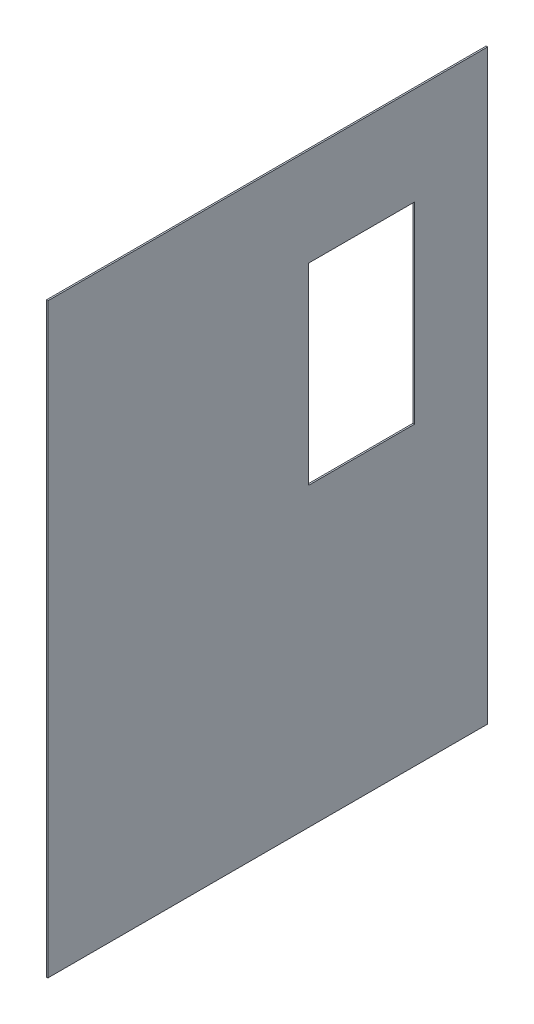
ISO-10303-21;
HEADER;
FILE_DESCRIPTION(('STEP AP214'),'2;1');
FILE_NAME('part.step','',(''),(''),'','','');
FILE_SCHEMA(('AUTOMOTIVE_DESIGN { 1 0 10303 214 1 1 1 1 }'));
ENDSEC;
DATA;
#1=APPLICATION_CONTEXT('core data for automotive mechanical design processes');
#2=APPLICATION_PROTOCOL_DEFINITION('international standard','automotive_design',2000,#1);
#3=PRODUCT_CONTEXT('',#1,'mechanical');
#4=PRODUCT('Part','Part','',(#3));
#5=PRODUCT_RELATED_PRODUCT_CATEGORY('part','',(#4));
#6=PRODUCT_DEFINITION_FORMATION('','',#4);
#7=PRODUCT_DEFINITION_CONTEXT('part definition',#1,'design');
#8=PRODUCT_DEFINITION('design','',#6,#7);
#9=PRODUCT_DEFINITION_SHAPE('','',#8);
#10=(LENGTH_UNIT() NAMED_UNIT(*) SI_UNIT(.MILLI.,.METRE.));
#11=(NAMED_UNIT(*) PLANE_ANGLE_UNIT() SI_UNIT($,.RADIAN.));
#12=(NAMED_UNIT(*) SI_UNIT($,.STERADIAN.) SOLID_ANGLE_UNIT());
#13=UNCERTAINTY_MEASURE_WITH_UNIT(LENGTH_MEASURE(1.E-05),#10,'distance_accuracy_value','');
#14=(GEOMETRIC_REPRESENTATION_CONTEXT(3) GLOBAL_UNCERTAINTY_ASSIGNED_CONTEXT((#13)) GLOBAL_UNIT_ASSIGNED_CONTEXT((#10,
#11,#12)) REPRESENTATION_CONTEXT('',''));
#15=CARTESIAN_POINT('',(0.,0.,0.));
#16=DIRECTION('',(0.,0.,1.));
#17=DIRECTION('',(1.,0.,0.));
#18=AXIS2_PLACEMENT_3D('',#15,#16,#17);
#19=CARTESIAN_POINT('',(1.5875,609.6,457.2));
#20=DIRECTION('',(0.,0.,-1.));
#21=DIRECTION('',(0.,1.,0.));
#22=AXIS2_PLACEMENT_3D('',#19,#20,#21);
#23=PLANE('',#22);
#24=DIRECTION('',(0.,-1.,0.));
#25=VECTOR('',#24,1.);
#26=CARTESIAN_POINT('',(-1.5875,609.6,457.2));
#27=LINE('',#26,#25);
#28=CARTESIAN_POINT('',(-1.5875,609.6,457.2));
#29=VERTEX_POINT('',#28);
#30=CARTESIAN_POINT('',(-1.5875,-609.6,457.2));
#31=VERTEX_POINT('',#30);
#32=EDGE_CURVE('E146',#29,#31,#27,.T.);
#33=ORIENTED_EDGE('',*,*,#32,.T.);
#34=DIRECTION('',(-1.,0.,0.));
#35=VECTOR('',#34,1.);
#36=CARTESIAN_POINT('',(1.5875,-609.6,457.2));
#37=LINE('',#36,#35);
#38=CARTESIAN_POINT('',(1.5875,-609.6,457.2));
#39=VERTEX_POINT('',#38);
#40=EDGE_CURVE('E11',#39,#31,#37,.T.);
#41=ORIENTED_EDGE('',*,*,#40,.F.);
#42=DIRECTION('',(0.,-1.,0.));
#43=VECTOR('',#42,1.);
#44=CARTESIAN_POINT('',(1.5875,609.6,457.2));
#45=LINE('',#44,#43);
#46=CARTESIAN_POINT('',(1.5875,609.6,457.2));
#47=VERTEX_POINT('',#46);
#48=EDGE_CURVE('E151',#47,#39,#45,.T.);
#49=ORIENTED_EDGE('',*,*,#48,.F.);
#50=DIRECTION('',(-1.,0.,0.));
#51=VECTOR('',#50,1.);
#52=CARTESIAN_POINT('',(1.5875,609.6,457.2));
#53=LINE('',#52,#51);
#54=EDGE_CURVE('E165',#47,#29,#53,.T.);
#55=ORIENTED_EDGE('',*,*,#54,.T.);
#56=EDGE_LOOP('',(#33,#41,#49,#55));
#57=FACE_BOUND('',#56,.T.);
#58=ADVANCED_FACE('F38',(#57),#23,.F.);
#59=CARTESIAN_POINT('',(1.5875,-609.6,-457.2));
#60=DIRECTION('',(0.,1.,0.));
#61=DIRECTION('',(0.,0.,1.));
#62=AXIS2_PLACEMENT_3D('',#59,#60,#61);
#63=PLANE('',#62);
#64=DIRECTION('',(0.,0.,-1.));
#65=VECTOR('',#64,1.);
#66=CARTESIAN_POINT('',(-1.5875,-609.6,-457.2));
#67=LINE('',#66,#65);
#68=CARTESIAN_POINT('',(-1.5875,-609.6,-457.2));
#69=VERTEX_POINT('',#68);
#70=EDGE_CURVE('E169',#31,#69,#67,.T.);
#71=ORIENTED_EDGE('',*,*,#70,.T.);
#72=DIRECTION('',(-1.,0.,0.));
#73=VECTOR('',#72,1.);
#74=CARTESIAN_POINT('',(1.5875,-609.6,-457.2));
#75=LINE('',#74,#73);
#76=CARTESIAN_POINT('',(1.5875,-609.6,-457.2));
#77=VERTEX_POINT('',#76);
#78=EDGE_CURVE('E46',#77,#69,#75,.T.);
#79=ORIENTED_EDGE('',*,*,#78,.F.);
#80=DIRECTION('',(0.,0.,-1.));
#81=VECTOR('',#80,1.);
#82=CARTESIAN_POINT('',(1.5875,-609.6,-457.2));
#83=LINE('',#82,#81);
#84=EDGE_CURVE('E155',#39,#77,#83,.T.);
#85=ORIENTED_EDGE('',*,*,#84,.F.);
#86=ORIENTED_EDGE('',*,*,#40,.T.);
#87=EDGE_LOOP('',(#71,#79,#85,#86));
#88=FACE_BOUND('',#87,.T.);
#89=ADVANCED_FACE('F203',(#88),#63,.F.);
#90=CARTESIAN_POINT('',(1.5875,609.6,-457.2));
#91=DIRECTION('',(0.,0.,1.));
#92=DIRECTION('',(0.,-1.,0.));
#93=AXIS2_PLACEMENT_3D('',#90,#91,#92);
#94=PLANE('',#93);
#95=DIRECTION('',(0.,1.,0.));
#96=VECTOR('',#95,1.);
#97=CARTESIAN_POINT('',(-1.5875,609.6,-457.2));
#98=LINE('',#97,#96);
#99=CARTESIAN_POINT('',(-1.5875,609.6,-457.2));
#100=VERTEX_POINT('',#99);
#101=EDGE_CURVE('E172',#69,#100,#98,.T.);
#102=ORIENTED_EDGE('',*,*,#101,.T.);
#103=DIRECTION('',(-1.,0.,0.));
#104=VECTOR('',#103,1.);
#105=CARTESIAN_POINT('',(1.5875,609.6,-457.2));
#106=LINE('',#105,#104);
#107=CARTESIAN_POINT('',(1.5875,609.6,-457.2));
#108=VERTEX_POINT('',#107);
#109=EDGE_CURVE('E180',#108,#100,#106,.T.);
#110=ORIENTED_EDGE('',*,*,#109,.F.);
#111=DIRECTION('',(0.,1.,0.));
#112=VECTOR('',#111,1.);
#113=CARTESIAN_POINT('',(1.5875,609.6,-457.2));
#114=LINE('',#113,#112);
#115=EDGE_CURVE('E159',#77,#108,#114,.T.);
#116=ORIENTED_EDGE('',*,*,#115,.F.);
#117=ORIENTED_EDGE('',*,*,#78,.T.);
#118=EDGE_LOOP('',(#102,#110,#116,#117));
#119=FACE_BOUND('',#118,.T.);
#120=ADVANCED_FACE('F189',(#119),#94,.F.);
#121=CARTESIAN_POINT('',(1.5875,609.6,-457.2));
#122=DIRECTION('',(0.,-1.,0.));
#123=DIRECTION('',(0.,0.,-1.));
#124=AXIS2_PLACEMENT_3D('',#121,#122,#123);
#125=PLANE('',#124);
#126=DIRECTION('',(0.,0.,1.));
#127=VECTOR('',#126,1.);
#128=CARTESIAN_POINT('',(-1.5875,609.6,-457.2));
#129=LINE('',#128,#127);
#130=EDGE_CURVE('E156',#100,#29,#129,.T.);
#131=ORIENTED_EDGE('',*,*,#130,.T.);
#132=ORIENTED_EDGE('',*,*,#54,.F.);
#133=DIRECTION('',(0.,0.,1.));
#134=VECTOR('',#133,1.);
#135=CARTESIAN_POINT('',(1.5875,609.6,-457.2));
#136=LINE('',#135,#134);
#137=EDGE_CURVE('E162',#108,#47,#136,.T.);
#138=ORIENTED_EDGE('',*,*,#137,.F.);
#139=ORIENTED_EDGE('',*,*,#109,.T.);
#140=EDGE_LOOP('',(#131,#132,#138,#139));
#141=FACE_BOUND('',#140,.T.);
#142=ADVANCED_FACE('F198',(#141),#125,.F.);
#143=CARTESIAN_POINT('',(1.5875,0.,0.));
#144=DIRECTION('',(-1.,0.,0.));
#145=DIRECTION('',(0.,0.,1.));
#146=AXIS2_PLACEMENT_3D('',#143,#144,#145);
#147=PLANE('',#146);
#148=DIRECTION('',(0.,0.,1.));
#149=VECTOR('',#148,1.);
#150=CARTESIAN_POINT('',(1.5875,406.4,-84.8));
#151=LINE('',#150,#149);
#152=CARTESIAN_POINT('',(1.5875,406.4,-304.8));
#153=VERTEX_POINT('',#152);
#154=CARTESIAN_POINT('',(1.5875,406.4,-84.8));
#155=VERTEX_POINT('',#154);
#156=EDGE_CURVE('E115',#153,#155,#151,.T.);
#157=ORIENTED_EDGE('',*,*,#156,.F.);
#158=DIRECTION('',(0.,1.,0.));
#159=VECTOR('',#158,1.);
#160=CARTESIAN_POINT('',(1.5875,406.4,-304.8));
#161=LINE('',#160,#159);
#162=CARTESIAN_POINT('',(1.5875,6.40000000000013,-304.8));
#163=VERTEX_POINT('',#162);
#164=EDGE_CURVE('E53',#163,#153,#161,.T.);
#165=ORIENTED_EDGE('',*,*,#164,.F.);
#166=DIRECTION('',(0.,0.,-1.));
#167=VECTOR('',#166,1.);
#168=CARTESIAN_POINT('',(1.5875,6.40000000000013,-84.8000000000001));
#169=LINE('',#168,#167);
#170=CARTESIAN_POINT('',(1.5875,6.40000000000013,-84.8000000000001));
#171=VERTEX_POINT('',#170);
#172=EDGE_CURVE('E123',#171,#163,#169,.T.);
#173=ORIENTED_EDGE('',*,*,#172,.F.);
#174=DIRECTION('',(0.,-1.,0.));
#175=VECTOR('',#174,1.);
#176=CARTESIAN_POINT('',(1.5875,406.4,-84.8));
#177=LINE('',#176,#175);
#178=EDGE_CURVE('E105',#155,#171,#177,.T.);
#179=ORIENTED_EDGE('',*,*,#178,.F.);
#180=EDGE_LOOP('',(#157,#165,#173,#179));
#181=FACE_BOUND('',#180,.T.);
#182=ORIENTED_EDGE('',*,*,#48,.T.);
#183=ORIENTED_EDGE('',*,*,#84,.T.);
#184=ORIENTED_EDGE('',*,*,#115,.T.);
#185=ORIENTED_EDGE('',*,*,#137,.T.);
#186=EDGE_LOOP('',(#182,#183,#184,#185));
#187=FACE_BOUND('',#186,.T.);
#188=ADVANCED_FACE('F120',(#181,#187),#147,.F.);
#189=CARTESIAN_POINT('',(-1.5875,0.,0.));
#190=DIRECTION('',(-1.,0.,0.));
#191=DIRECTION('',(0.,0.,1.));
#192=AXIS2_PLACEMENT_3D('',#189,#190,#191);
#193=PLANE('',#192);
#194=DIRECTION('',(0.,1.,0.));
#195=VECTOR('',#194,1.);
#196=CARTESIAN_POINT('',(-1.5875,406.4,-304.8));
#197=LINE('',#196,#195);
#198=CARTESIAN_POINT('',(-1.5875,6.40000000000013,-304.8));
#199=VERTEX_POINT('',#198);
#200=CARTESIAN_POINT('',(-1.5875,406.4,-304.8));
#201=VERTEX_POINT('',#200);
#202=EDGE_CURVE('E127',#199,#201,#197,.T.);
#203=ORIENTED_EDGE('',*,*,#202,.T.);
#204=DIRECTION('',(0.,0.,1.));
#205=VECTOR('',#204,1.);
#206=CARTESIAN_POINT('',(-1.5875,406.4,-84.8));
#207=LINE('',#206,#205);
#208=CARTESIAN_POINT('',(-1.5875,406.4,-84.8));
#209=VERTEX_POINT('',#208);
#210=EDGE_CURVE('E134',#201,#209,#207,.T.);
#211=ORIENTED_EDGE('',*,*,#210,.T.);
#212=DIRECTION('',(0.,-1.,0.));
#213=VECTOR('',#212,1.);
#214=CARTESIAN_POINT('',(-1.5875,406.4,-84.8));
#215=LINE('',#214,#213);
#216=CARTESIAN_POINT('',(-1.5875,6.40000000000013,-84.8000000000001));
#217=VERTEX_POINT('',#216);
#218=EDGE_CURVE('E61',#209,#217,#215,.T.);
#219=ORIENTED_EDGE('',*,*,#218,.T.);
#220=DIRECTION('',(0.,0.,-1.));
#221=VECTOR('',#220,1.);
#222=CARTESIAN_POINT('',(-1.5875,6.40000000000013,-84.8000000000001));
#223=LINE('',#222,#221);
#224=EDGE_CURVE('E139',#217,#199,#223,.T.);
#225=ORIENTED_EDGE('',*,*,#224,.T.);
#226=EDGE_LOOP('',(#203,#211,#219,#225));
#227=FACE_BOUND('',#226,.T.);
#228=ORIENTED_EDGE('',*,*,#32,.F.);
#229=ORIENTED_EDGE('',*,*,#130,.F.);
#230=ORIENTED_EDGE('',*,*,#101,.F.);
#231=ORIENTED_EDGE('',*,*,#70,.F.);
#232=EDGE_LOOP('',(#228,#229,#230,#231));
#233=FACE_BOUND('',#232,.T.);
#234=ADVANCED_FACE('F195',(#227,#233),#193,.T.);
#235=CARTESIAN_POINT('',(-1.5875,406.4,-304.8));
#236=DIRECTION('',(0.,0.,-1.));
#237=DIRECTION('',(-1.,0.,0.));
#238=AXIS2_PLACEMENT_3D('',#235,#236,#237);
#239=PLANE('',#238);
#240=DIRECTION('',(1.,0.,0.));
#241=VECTOR('',#240,1.);
#242=CARTESIAN_POINT('',(-1.5875,406.4,-304.8));
#243=LINE('',#242,#241);
#244=EDGE_CURVE('E112',#201,#153,#243,.T.);
#245=ORIENTED_EDGE('',*,*,#244,.F.);
#246=ORIENTED_EDGE('',*,*,#202,.F.);
#247=DIRECTION('',(1.,0.,0.));
#248=VECTOR('',#247,1.);
#249=CARTESIAN_POINT('',(-1.5875,6.40000000000013,-304.8));
#250=LINE('',#249,#248);
#251=EDGE_CURVE('E143',#199,#163,#250,.T.);
#252=ORIENTED_EDGE('',*,*,#251,.T.);
#253=ORIENTED_EDGE('',*,*,#164,.T.);
#254=EDGE_LOOP('',(#245,#246,#252,#253));
#255=FACE_BOUND('',#254,.T.);
#256=ADVANCED_FACE('F215',(#255),#239,.F.);
#257=CARTESIAN_POINT('',(-1.5875,6.40000000000013,-84.8000000000001));
#258=DIRECTION('',(0.,-1.,0.));
#259=DIRECTION('',(0.,0.,-1.));
#260=AXIS2_PLACEMENT_3D('',#257,#258,#259);
#261=PLANE('',#260);
#262=ORIENTED_EDGE('',*,*,#251,.F.);
#263=ORIENTED_EDGE('',*,*,#224,.F.);
#264=DIRECTION('',(1.,0.,0.));
#265=VECTOR('',#264,1.);
#266=CARTESIAN_POINT('',(-1.5875,6.40000000000013,-84.8000000000001));
#267=LINE('',#266,#265);
#268=EDGE_CURVE('E111',#217,#171,#267,.T.);
#269=ORIENTED_EDGE('',*,*,#268,.T.);
#270=ORIENTED_EDGE('',*,*,#172,.T.);
#271=EDGE_LOOP('',(#262,#263,#269,#270));
#272=FACE_BOUND('',#271,.T.);
#273=ADVANCED_FACE('F221',(#272),#261,.F.);
#274=CARTESIAN_POINT('',(-1.5875,406.4,-84.8));
#275=DIRECTION('',(0.,0.,1.));
#276=DIRECTION('',(0.,-1.,0.));
#277=AXIS2_PLACEMENT_3D('',#274,#275,#276);
#278=PLANE('',#277);
#279=ORIENTED_EDGE('',*,*,#268,.F.);
#280=ORIENTED_EDGE('',*,*,#218,.F.);
#281=DIRECTION('',(1.,0.,0.));
#282=VECTOR('',#281,1.);
#283=CARTESIAN_POINT('',(-1.5875,406.4,-84.8));
#284=LINE('',#283,#282);
#285=EDGE_CURVE('E101',#209,#155,#284,.T.);
#286=ORIENTED_EDGE('',*,*,#285,.T.);
#287=ORIENTED_EDGE('',*,*,#178,.T.);
#288=EDGE_LOOP('',(#279,#280,#286,#287));
#289=FACE_BOUND('',#288,.T.);
#290=ADVANCED_FACE('F103',(#289),#278,.F.);
#291=CARTESIAN_POINT('',(-1.5875,406.4,-84.8));
#292=DIRECTION('',(0.,1.,0.));
#293=DIRECTION('',(0.,0.,1.));
#294=AXIS2_PLACEMENT_3D('',#291,#292,#293);
#295=PLANE('',#294);
#296=ORIENTED_EDGE('',*,*,#285,.F.);
#297=ORIENTED_EDGE('',*,*,#210,.F.);
#298=ORIENTED_EDGE('',*,*,#244,.T.);
#299=ORIENTED_EDGE('',*,*,#156,.T.);
#300=EDGE_LOOP('',(#296,#297,#298,#299));
#301=FACE_BOUND('',#300,.T.);
#302=ADVANCED_FACE('F116',(#301),#295,.F.);
#303=CLOSED_SHELL('',(#58,#89,#120,#142,#188,#234,#256,#273,#290,#302));
#304=MANIFOLD_SOLID_BREP('B2',#303);
#305=ADVANCED_BREP_SHAPE_REPRESENTATION('',(#18,#304),#14);
#306=SHAPE_DEFINITION_REPRESENTATION(#9,#305);
ENDSEC;
END-ISO-10303-21;
